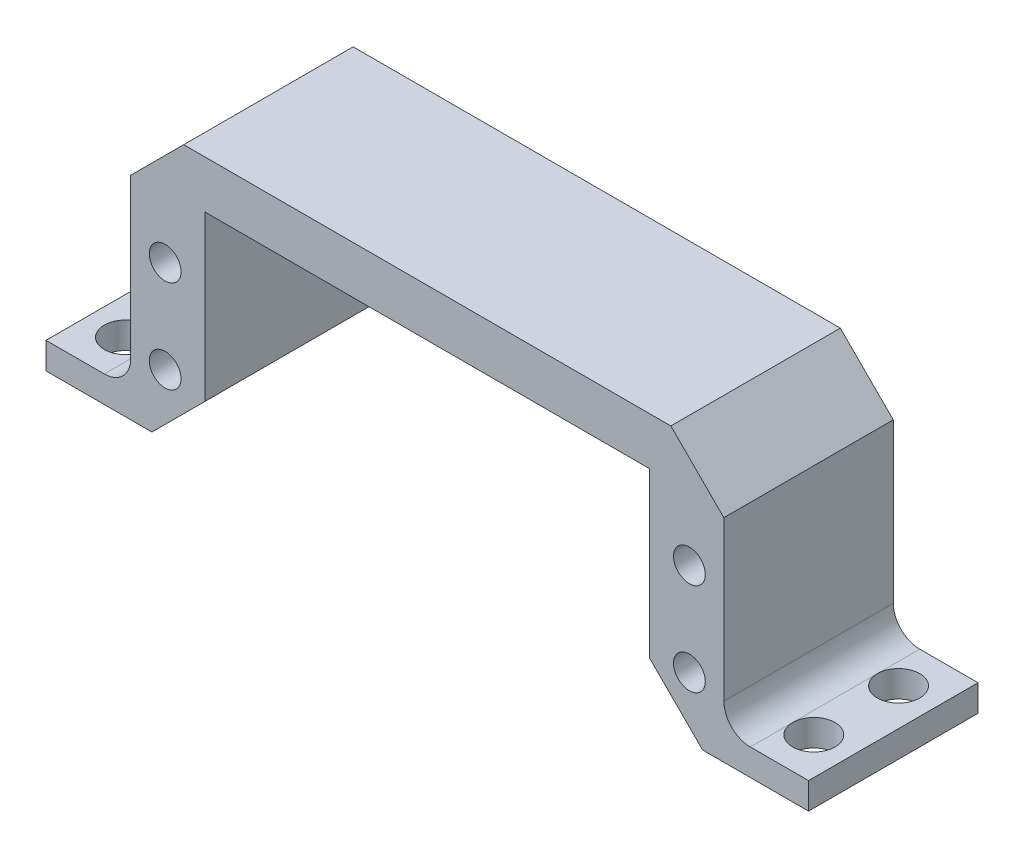
ISO-10303-21;
HEADER;
FILE_DESCRIPTION(('STEP AP214'),'2;1');
FILE_NAME('part.step','',(''),(''),'','','');
FILE_SCHEMA(('AUTOMOTIVE_DESIGN { 1 0 10303 214 1 1 1 1 }'));
ENDSEC;
DATA;
#1=APPLICATION_CONTEXT('core data for automotive mechanical design processes');
#2=APPLICATION_PROTOCOL_DEFINITION('international standard','automotive_design',2000,#1);
#3=PRODUCT_CONTEXT('',#1,'mechanical');
#4=PRODUCT('Part','Part','',(#3));
#5=PRODUCT_RELATED_PRODUCT_CATEGORY('part','',(#4));
#6=PRODUCT_DEFINITION_FORMATION('','',#4);
#7=PRODUCT_DEFINITION_CONTEXT('part definition',#1,'design');
#8=PRODUCT_DEFINITION('design','',#6,#7);
#9=PRODUCT_DEFINITION_SHAPE('','',#8);
#10=(LENGTH_UNIT() NAMED_UNIT(*) SI_UNIT(.MILLI.,.METRE.));
#11=(NAMED_UNIT(*) PLANE_ANGLE_UNIT() SI_UNIT($,.RADIAN.));
#12=(NAMED_UNIT(*) SI_UNIT($,.STERADIAN.) SOLID_ANGLE_UNIT());
#13=UNCERTAINTY_MEASURE_WITH_UNIT(LENGTH_MEASURE(1.E-05),#10,'distance_accuracy_value','');
#14=(GEOMETRIC_REPRESENTATION_CONTEXT(3) GLOBAL_UNCERTAINTY_ASSIGNED_CONTEXT((#13)) GLOBAL_UNIT_ASSIGNED_CONTEXT((#10,
#11,#12)) REPRESENTATION_CONTEXT('',''));
#15=CARTESIAN_POINT('',(0.,0.,0.));
#16=DIRECTION('',(0.,0.,1.));
#17=DIRECTION('',(1.,0.,0.));
#18=AXIS2_PLACEMENT_3D('',#15,#16,#17);
#19=CARTESIAN_POINT('',(-36.,0.,8.));
#20=DIRECTION('',(1.,0.,0.));
#21=DIRECTION('',(0.,0.,-1.));
#22=AXIS2_PLACEMENT_3D('',#19,#20,#21);
#23=PLANE('',#22);
#24=DIRECTION('',(0.,-1.,0.));
#25=VECTOR('',#24,1.);
#26=CARTESIAN_POINT('',(-36.,0.,-8.));
#27=LINE('',#26,#25);
#28=CARTESIAN_POINT('',(-36.,2.5,-8.));
#29=VERTEX_POINT('',#28);
#30=CARTESIAN_POINT('',(-36.,0.,-8.));
#31=VERTEX_POINT('',#30);
#32=EDGE_CURVE('E194',#29,#31,#27,.T.);
#33=ORIENTED_EDGE('',*,*,#32,.T.);
#34=DIRECTION('',(0.,0.,-1.));
#35=VECTOR('',#34,1.);
#36=CARTESIAN_POINT('',(-36.,0.,8.));
#37=LINE('',#36,#35);
#38=CARTESIAN_POINT('',(-36.,0.,8.));
#39=VERTEX_POINT('',#38);
#40=EDGE_CURVE('E174',#39,#31,#37,.T.);
#41=ORIENTED_EDGE('',*,*,#40,.F.);
#42=DIRECTION('',(0.,-1.,0.));
#43=VECTOR('',#42,1.);
#44=CARTESIAN_POINT('',(-36.,0.,8.));
#45=LINE('',#44,#43);
#46=CARTESIAN_POINT('',(-36.,2.5,8.));
#47=VERTEX_POINT('',#46);
#48=EDGE_CURVE('E181',#47,#39,#45,.T.);
#49=ORIENTED_EDGE('',*,*,#48,.F.);
#50=DIRECTION('',(0.,0.,-1.));
#51=VECTOR('',#50,1.);
#52=CARTESIAN_POINT('',(-36.,2.5,8.));
#53=LINE('',#52,#51);
#54=EDGE_CURVE('E283',#47,#29,#53,.T.);
#55=ORIENTED_EDGE('',*,*,#54,.T.);
#56=EDGE_LOOP('',(#33,#41,#49,#55));
#57=FACE_BOUND('',#56,.T.);
#58=ADVANCED_FACE('F35',(#57),#23,.F.);
#59=CARTESIAN_POINT('',(-36.,0.,8.));
#60=DIRECTION('',(0.,1.,0.));
#61=DIRECTION('',(-1.,0.,0.));
#62=AXIS2_PLACEMENT_3D('',#59,#60,#61);
#63=PLANE('',#62);
#64=CARTESIAN_POINT('',(-32.5,0.,-4.));
#65=DIRECTION('',(0.,1.,0.));
#66=DIRECTION('',(0.,0.,1.));
#67=AXIS2_PLACEMENT_3D('',#64,#65,#66);
#68=CIRCLE('',#67,2.);
#69=CARTESIAN_POINT('',(-32.5,0.,-1.99999999999999));
#70=VERTEX_POINT('',#69);
#71=EDGE_CURVE('E386',#70,#70,#68,.T.);
#72=ORIENTED_EDGE('',*,*,#71,.T.);
#73=EDGE_LOOP('',(#72));
#74=FACE_BOUND('',#73,.T.);
#75=CARTESIAN_POINT('',(-32.5,0.,4.));
#76=DIRECTION('',(0.,1.,0.));
#77=DIRECTION('',(0.,0.,1.));
#78=AXIS2_PLACEMENT_3D('',#75,#76,#77);
#79=CIRCLE('',#78,2.);
#80=CARTESIAN_POINT('',(-32.5,0.,6.00000000000001));
#81=VERTEX_POINT('',#80);
#82=EDGE_CURVE('E396',#81,#81,#79,.T.);
#83=ORIENTED_EDGE('',*,*,#82,.T.);
#84=EDGE_LOOP('',(#83));
#85=FACE_BOUND('',#84,.T.);
#86=DIRECTION('',(1.,0.,0.));
#87=VECTOR('',#86,1.);
#88=CARTESIAN_POINT('',(-36.,0.,-8.));
#89=LINE('',#88,#87);
#90=CARTESIAN_POINT('',(-26.,0.,-8.));
#91=VERTEX_POINT('',#90);
#92=EDGE_CURVE('E292',#31,#91,#89,.T.);
#93=ORIENTED_EDGE('',*,*,#92,.T.);
#94=DIRECTION('',(0.,0.,1.));
#95=VECTOR('',#94,1.);
#96=CARTESIAN_POINT('',(-26.,0.,8.));
#97=LINE('',#96,#95);
#98=CARTESIAN_POINT('',(-26.,0.,8.));
#99=VERTEX_POINT('',#98);
#100=EDGE_CURVE('E177',#91,#99,#97,.T.);
#101=ORIENTED_EDGE('',*,*,#100,.T.);
#102=DIRECTION('',(1.,0.,0.));
#103=VECTOR('',#102,1.);
#104=CARTESIAN_POINT('',(-36.,0.,8.));
#105=LINE('',#104,#103);
#106=EDGE_CURVE('E169',#39,#99,#105,.T.);
#107=ORIENTED_EDGE('',*,*,#106,.F.);
#108=ORIENTED_EDGE('',*,*,#40,.T.);
#109=EDGE_LOOP('',(#93,#101,#107,#108));
#110=FACE_BOUND('',#109,.T.);
#111=ADVANCED_FACE('F172',(#74,#85,#110),#63,.F.);
#112=CARTESIAN_POINT('',(-21.,0.,8.));
#113=DIRECTION('',(-1.,0.,0.));
#114=DIRECTION('',(0.,-1.,0.));
#115=AXIS2_PLACEMENT_3D('',#112,#113,#114);
#116=PLANE('',#115);
#117=DIRECTION('',(0.,1.,0.));
#118=VECTOR('',#117,1.);
#119=CARTESIAN_POINT('',(-21.,0.,8.));
#120=LINE('',#119,#118);
#121=CARTESIAN_POINT('',(-21.,4.99999999999999,8.));
#122=VERTEX_POINT('',#121);
#123=CARTESIAN_POINT('',(-21.,20.5,8.));
#124=VERTEX_POINT('',#123);
#125=EDGE_CURVE('E180',#122,#124,#120,.T.);
#126=ORIENTED_EDGE('',*,*,#125,.F.);
#127=DIRECTION('',(0.,0.,-1.));
#128=VECTOR('',#127,1.);
#129=CARTESIAN_POINT('',(-21.,4.99999999999999,8.));
#130=LINE('',#129,#128);
#131=CARTESIAN_POINT('',(-21.,4.99999999999999,-8.));
#132=VERTEX_POINT('',#131);
#133=EDGE_CURVE('E224',#122,#132,#130,.T.);
#134=ORIENTED_EDGE('',*,*,#133,.T.);
#135=DIRECTION('',(0.,1.,0.));
#136=VECTOR('',#135,1.);
#137=CARTESIAN_POINT('',(-21.,0.,-8.));
#138=LINE('',#137,#136);
#139=CARTESIAN_POINT('',(-21.,20.5,-8.));
#140=VERTEX_POINT('',#139);
#141=EDGE_CURVE('E295',#132,#140,#138,.T.);
#142=ORIENTED_EDGE('',*,*,#141,.T.);
#143=DIRECTION('',(0.,0.,-1.));
#144=VECTOR('',#143,1.);
#145=CARTESIAN_POINT('',(-21.,20.5,8.));
#146=LINE('',#145,#144);
#147=EDGE_CURVE('E196',#124,#140,#146,.T.);
#148=ORIENTED_EDGE('',*,*,#147,.F.);
#149=EDGE_LOOP('',(#126,#134,#142,#148));
#150=FACE_BOUND('',#149,.T.);
#151=ADVANCED_FACE('F428',(#150),#116,.F.);
#152=CARTESIAN_POINT('',(-21.,20.5,8.));
#153=DIRECTION('',(0.,1.,0.));
#154=DIRECTION('',(0.,0.,1.));
#155=AXIS2_PLACEMENT_3D('',#152,#153,#154);
#156=PLANE('',#155);
#157=DIRECTION('',(1.,0.,0.));
#158=VECTOR('',#157,1.);
#159=CARTESIAN_POINT('',(-21.,20.5,-8.));
#160=LINE('',#159,#158);
#161=CARTESIAN_POINT('',(21.,20.5,-8.));
#162=VERTEX_POINT('',#161);
#163=EDGE_CURVE('E297',#140,#162,#160,.T.);
#164=ORIENTED_EDGE('',*,*,#163,.T.);
#165=DIRECTION('',(0.,0.,-1.));
#166=VECTOR('',#165,1.);
#167=CARTESIAN_POINT('',(21.,20.5,8.));
#168=LINE('',#167,#166);
#169=CARTESIAN_POINT('',(21.,20.5,8.));
#170=VERTEX_POINT('',#169);
#171=EDGE_CURVE('E202',#170,#162,#168,.T.);
#172=ORIENTED_EDGE('',*,*,#171,.F.);
#173=DIRECTION('',(1.,0.,0.));
#174=VECTOR('',#173,1.);
#175=CARTESIAN_POINT('',(-21.,20.5,8.));
#176=LINE('',#175,#174);
#177=EDGE_CURVE('E345',#124,#170,#176,.T.);
#178=ORIENTED_EDGE('',*,*,#177,.F.);
#179=ORIENTED_EDGE('',*,*,#147,.T.);
#180=EDGE_LOOP('',(#164,#172,#178,#179));
#181=FACE_BOUND('',#180,.T.);
#182=ADVANCED_FACE('F426',(#181),#156,.F.);
#183=CARTESIAN_POINT('',(21.,20.5,8.));
#184=DIRECTION('',(1.,0.,0.));
#185=DIRECTION('',(0.,0.,-1.));
#186=AXIS2_PLACEMENT_3D('',#183,#184,#185);
#187=PLANE('',#186);
#188=DIRECTION('',(0.,-1.,0.));
#189=VECTOR('',#188,1.);
#190=CARTESIAN_POINT('',(21.,20.5,-8.));
#191=LINE('',#190,#189);
#192=CARTESIAN_POINT('',(21.,5.00000000000002,-8.));
#193=VERTEX_POINT('',#192);
#194=EDGE_CURVE('E299',#162,#193,#191,.T.);
#195=ORIENTED_EDGE('',*,*,#194,.T.);
#196=DIRECTION('',(0.,0.,1.));
#197=VECTOR('',#196,1.);
#198=CARTESIAN_POINT('',(21.,5.00000000000002,8.));
#199=LINE('',#198,#197);
#200=CARTESIAN_POINT('',(21.,5.00000000000002,8.));
#201=VERTEX_POINT('',#200);
#202=EDGE_CURVE('E214',#193,#201,#199,.T.);
#203=ORIENTED_EDGE('',*,*,#202,.T.);
#204=DIRECTION('',(0.,-1.,0.));
#205=VECTOR('',#204,1.);
#206=CARTESIAN_POINT('',(21.,20.5,8.));
#207=LINE('',#206,#205);
#208=EDGE_CURVE('E325',#170,#201,#207,.T.);
#209=ORIENTED_EDGE('',*,*,#208,.F.);
#210=ORIENTED_EDGE('',*,*,#171,.T.);
#211=EDGE_LOOP('',(#195,#203,#209,#210));
#212=FACE_BOUND('',#211,.T.);
#213=ADVANCED_FACE('F323',(#212),#187,.F.);
#214=CARTESIAN_POINT('',(21.,0.,8.));
#215=DIRECTION('',(0.,1.,0.));
#216=DIRECTION('',(0.,0.,1.));
#217=AXIS2_PLACEMENT_3D('',#214,#215,#216);
#218=PLANE('',#217);
#219=CARTESIAN_POINT('',(32.5,0.,4.));
#220=DIRECTION('',(0.,1.,0.));
#221=DIRECTION('',(0.,0.,1.));
#222=AXIS2_PLACEMENT_3D('',#219,#220,#221);
#223=CIRCLE('',#222,2.00000000000001);
#224=CARTESIAN_POINT('',(32.5,0.,6.00000000000001));
#225=VERTEX_POINT('',#224);
#226=EDGE_CURVE('E385',#225,#225,#223,.T.);
#227=ORIENTED_EDGE('',*,*,#226,.T.);
#228=EDGE_LOOP('',(#227));
#229=FACE_BOUND('',#228,.T.);
#230=CARTESIAN_POINT('',(32.5,0.,-4.));
#231=DIRECTION('',(0.,1.,0.));
#232=DIRECTION('',(0.,0.,1.));
#233=AXIS2_PLACEMENT_3D('',#230,#231,#232);
#234=CIRCLE('',#233,2.00000000000001);
#235=CARTESIAN_POINT('',(32.5,0.,-1.99999999999999));
#236=VERTEX_POINT('',#235);
#237=EDGE_CURVE('E397',#236,#236,#234,.T.);
#238=ORIENTED_EDGE('',*,*,#237,.T.);
#239=EDGE_LOOP('',(#238));
#240=FACE_BOUND('',#239,.T.);
#241=DIRECTION('',(1.,0.,0.));
#242=VECTOR('',#241,1.);
#243=CARTESIAN_POINT('',(21.,0.,8.));
#244=LINE('',#243,#242);
#245=CARTESIAN_POINT('',(26.,0.,8.));
#246=VERTEX_POINT('',#245);
#247=CARTESIAN_POINT('',(36.,0.,8.));
#248=VERTEX_POINT('',#247);
#249=EDGE_CURVE('E339',#246,#248,#244,.T.);
#250=ORIENTED_EDGE('',*,*,#249,.F.);
#251=DIRECTION('',(0.,0.,-1.));
#252=VECTOR('',#251,1.);
#253=CARTESIAN_POINT('',(26.,0.,8.));
#254=LINE('',#253,#252);
#255=CARTESIAN_POINT('',(26.,0.,-8.));
#256=VERTEX_POINT('',#255);
#257=EDGE_CURVE('E195',#246,#256,#254,.T.);
#258=ORIENTED_EDGE('',*,*,#257,.T.);
#259=DIRECTION('',(1.,0.,0.));
#260=VECTOR('',#259,1.);
#261=CARTESIAN_POINT('',(21.,0.,-8.));
#262=LINE('',#261,#260);
#263=CARTESIAN_POINT('',(36.,0.,-8.));
#264=VERTEX_POINT('',#263);
#265=EDGE_CURVE('E302',#256,#264,#262,.T.);
#266=ORIENTED_EDGE('',*,*,#265,.T.);
#267=DIRECTION('',(0.,0.,-1.));
#268=VECTOR('',#267,1.);
#269=CARTESIAN_POINT('',(36.,0.,8.));
#270=LINE('',#269,#268);
#271=EDGE_CURVE('E316',#248,#264,#270,.T.);
#272=ORIENTED_EDGE('',*,*,#271,.F.);
#273=EDGE_LOOP('',(#250,#258,#266,#272));
#274=FACE_BOUND('',#273,.T.);
#275=ADVANCED_FACE('F337',(#229,#240,#274),#218,.F.);
#276=CARTESIAN_POINT('',(36.,0.,8.));
#277=DIRECTION('',(-1.,0.,0.));
#278=DIRECTION('',(0.,0.,1.));
#279=AXIS2_PLACEMENT_3D('',#276,#277,#278);
#280=PLANE('',#279);
#281=DIRECTION('',(0.,1.,0.));
#282=VECTOR('',#281,1.);
#283=CARTESIAN_POINT('',(36.,0.,-8.));
#284=LINE('',#283,#282);
#285=CARTESIAN_POINT('',(36.,2.5,-8.));
#286=VERTEX_POINT('',#285);
#287=EDGE_CURVE('E304',#264,#286,#284,.T.);
#288=ORIENTED_EDGE('',*,*,#287,.T.);
#289=DIRECTION('',(0.,0.,-1.));
#290=VECTOR('',#289,1.);
#291=CARTESIAN_POINT('',(36.,2.5,8.));
#292=LINE('',#291,#290);
#293=CARTESIAN_POINT('',(36.,2.5,8.));
#294=VERTEX_POINT('',#293);
#295=EDGE_CURVE('E285',#294,#286,#292,.T.);
#296=ORIENTED_EDGE('',*,*,#295,.F.);
#297=DIRECTION('',(0.,1.,0.));
#298=VECTOR('',#297,1.);
#299=CARTESIAN_POINT('',(36.,0.,8.));
#300=LINE('',#299,#298);
#301=EDGE_CURVE('E341',#248,#294,#300,.T.);
#302=ORIENTED_EDGE('',*,*,#301,.F.);
#303=ORIENTED_EDGE('',*,*,#271,.T.);
#304=EDGE_LOOP('',(#288,#296,#302,#303));
#305=FACE_BOUND('',#304,.T.);
#306=ADVANCED_FACE('F384',(#305),#280,.F.);
#307=CARTESIAN_POINT('',(36.,2.5,8.));
#308=DIRECTION('',(0.,-1.,0.));
#309=DIRECTION('',(1.,0.,0.));
#310=AXIS2_PLACEMENT_3D('',#307,#308,#309);
#311=PLANE('',#310);
#312=DIRECTION('',(0.,0.,-1.));
#313=VECTOR('',#312,1.);
#314=CARTESIAN_POINT('',(30.5,2.5,8.));
#315=LINE('',#314,#313);
#316=CARTESIAN_POINT('',(30.5,2.5,-4.));
#317=VERTEX_POINT('',#316);
#318=CARTESIAN_POINT('',(30.5,2.5,4.));
#319=VERTEX_POINT('',#318);
#320=EDGE_CURVE('E247',#317,#319,#315,.F.);
#321=ORIENTED_EDGE('',*,*,#320,.T.);
#322=CARTESIAN_POINT('',(32.5,2.5,4.));
#323=DIRECTION('',(0.,1.,0.));
#324=DIRECTION('',(0.,0.,1.));
#325=AXIS2_PLACEMENT_3D('',#322,#323,#324);
#326=CIRCLE('',#325,2.00000000000001);
#327=EDGE_CURVE('E48',#319,#319,#326,.T.);
#328=ORIENTED_EDGE('',*,*,#327,.F.);
#329=CARTESIAN_POINT('',(30.5,2.5,8.));
#330=VERTEX_POINT('',#329);
#331=EDGE_CURVE('E242',#319,#330,#315,.F.);
#332=ORIENTED_EDGE('',*,*,#331,.T.);
#333=DIRECTION('',(-1.,0.,0.));
#334=VECTOR('',#333,1.);
#335=CARTESIAN_POINT('',(36.,2.5,8.));
#336=LINE('',#335,#334);
#337=EDGE_CURVE('E343',#294,#330,#336,.T.);
#338=ORIENTED_EDGE('',*,*,#337,.F.);
#339=ORIENTED_EDGE('',*,*,#295,.T.);
#340=DIRECTION('',(-1.,0.,0.));
#341=VECTOR('',#340,1.);
#342=CARTESIAN_POINT('',(36.,2.5,-8.));
#343=LINE('',#342,#341);
#344=CARTESIAN_POINT('',(30.5,2.5,-8.));
#345=VERTEX_POINT('',#344);
#346=EDGE_CURVE('E306',#286,#345,#343,.T.);
#347=ORIENTED_EDGE('',*,*,#346,.T.);
#348=EDGE_CURVE('E243',#345,#317,#315,.F.);
#349=ORIENTED_EDGE('',*,*,#348,.T.);
#350=CARTESIAN_POINT('',(32.5,2.5,-4.));
#351=DIRECTION('',(0.,1.,0.));
#352=DIRECTION('',(0.,0.,1.));
#353=AXIS2_PLACEMENT_3D('',#350,#351,#352);
#354=CIRCLE('',#353,2.00000000000001);
#355=EDGE_CURVE('E53',#317,#317,#354,.T.);
#356=ORIENTED_EDGE('',*,*,#355,.F.);
#357=EDGE_LOOP('',(#321,#328,#332,#338,#339,#347,#349,#356));
#358=FACE_BOUND('',#357,.T.);
#359=ADVANCED_FACE('F380',(#358),#311,.F.);
#360=CARTESIAN_POINT('',(28.,25.,8.));
#361=DIRECTION('',(-1.,0.,0.));
#362=DIRECTION('',(0.,-1.,0.));
#363=AXIS2_PLACEMENT_3D('',#360,#361,#362);
#364=PLANE('',#363);
#365=DIRECTION('',(0.,1.,0.));
#366=VECTOR('',#365,1.);
#367=CARTESIAN_POINT('',(28.,25.,8.));
#368=LINE('',#367,#366);
#369=CARTESIAN_POINT('',(28.,5.00000000000001,8.));
#370=VERTEX_POINT('',#369);
#371=CARTESIAN_POINT('',(28.,20.,8.));
#372=VERTEX_POINT('',#371);
#373=EDGE_CURVE('E351',#370,#372,#368,.T.);
#374=ORIENTED_EDGE('',*,*,#373,.F.);
#375=DIRECTION('',(0.,0.,-1.));
#376=VECTOR('',#375,1.);
#377=CARTESIAN_POINT('',(28.,5.,-8.));
#378=LINE('',#377,#376);
#379=CARTESIAN_POINT('',(28.,5.00000000000001,-8.));
#380=VERTEX_POINT('',#379);
#381=EDGE_CURVE('E239',#370,#380,#378,.T.);
#382=ORIENTED_EDGE('',*,*,#381,.T.);
#383=DIRECTION('',(0.,1.,0.));
#384=VECTOR('',#383,1.);
#385=CARTESIAN_POINT('',(28.,25.,-8.));
#386=LINE('',#385,#384);
#387=CARTESIAN_POINT('',(28.,20.,-8.));
#388=VERTEX_POINT('',#387);
#389=EDGE_CURVE('E309',#380,#388,#386,.T.);
#390=ORIENTED_EDGE('',*,*,#389,.T.);
#391=DIRECTION('',(0.,0.,1.));
#392=VECTOR('',#391,1.);
#393=CARTESIAN_POINT('',(28.,20.,8.));
#394=LINE('',#393,#392);
#395=EDGE_CURVE('E236',#388,#372,#394,.T.);
#396=ORIENTED_EDGE('',*,*,#395,.T.);
#397=EDGE_LOOP('',(#374,#382,#390,#396));
#398=FACE_BOUND('',#397,.T.);
#399=ADVANCED_FACE('F370',(#398),#364,.F.);
#400=CARTESIAN_POINT('',(-28.,25.,8.));
#401=DIRECTION('',(0.,-1.,0.));
#402=DIRECTION('',(0.,0.,-1.));
#403=AXIS2_PLACEMENT_3D('',#400,#401,#402);
#404=PLANE('',#403);
#405=DIRECTION('',(-1.,0.,0.));
#406=VECTOR('',#405,1.);
#407=CARTESIAN_POINT('',(-28.,25.,-8.));
#408=LINE('',#407,#406);
#409=CARTESIAN_POINT('',(23.,25.,-8.));
#410=VERTEX_POINT('',#409);
#411=CARTESIAN_POINT('',(-23.,25.,-8.));
#412=VERTEX_POINT('',#411);
#413=EDGE_CURVE('E273',#410,#412,#408,.T.);
#414=ORIENTED_EDGE('',*,*,#413,.T.);
#415=DIRECTION('',(0.,0.,1.));
#416=VECTOR('',#415,1.);
#417=CARTESIAN_POINT('',(-23.,25.,8.));
#418=LINE('',#417,#416);
#419=CARTESIAN_POINT('',(-23.,25.,8.));
#420=VERTEX_POINT('',#419);
#421=EDGE_CURVE('E234',#412,#420,#418,.T.);
#422=ORIENTED_EDGE('',*,*,#421,.T.);
#423=DIRECTION('',(-1.,0.,0.));
#424=VECTOR('',#423,1.);
#425=CARTESIAN_POINT('',(-28.,25.,8.));
#426=LINE('',#425,#424);
#427=CARTESIAN_POINT('',(23.,25.,8.));
#428=VERTEX_POINT('',#427);
#429=EDGE_CURVE('E287',#428,#420,#426,.T.);
#430=ORIENTED_EDGE('',*,*,#429,.F.);
#431=DIRECTION('',(0.,0.,-1.));
#432=VECTOR('',#431,1.);
#433=CARTESIAN_POINT('',(23.,25.,8.));
#434=LINE('',#433,#432);
#435=EDGE_CURVE('E231',#428,#410,#434,.T.);
#436=ORIENTED_EDGE('',*,*,#435,.T.);
#437=EDGE_LOOP('',(#414,#422,#430,#436));
#438=FACE_BOUND('',#437,.T.);
#439=ADVANCED_FACE('F362',(#438),#404,.F.);
#440=CARTESIAN_POINT('',(-28.,2.5,8.));
#441=DIRECTION('',(1.,0.,0.));
#442=DIRECTION('',(0.,0.,-1.));
#443=AXIS2_PLACEMENT_3D('',#440,#441,#442);
#444=PLANE('',#443);
#445=DIRECTION('',(0.,-1.,0.));
#446=VECTOR('',#445,1.);
#447=CARTESIAN_POINT('',(-28.,2.5,-8.));
#448=LINE('',#447,#446);
#449=CARTESIAN_POINT('',(-28.,20.,-8.));
#450=VERTEX_POINT('',#449);
#451=CARTESIAN_POINT('',(-28.,5.,-8.));
#452=VERTEX_POINT('',#451);
#453=EDGE_CURVE('E264',#450,#452,#448,.T.);
#454=ORIENTED_EDGE('',*,*,#453,.T.);
#455=DIRECTION('',(0.,0.,-1.));
#456=VECTOR('',#455,1.);
#457=CARTESIAN_POINT('',(-28.,5.,8.));
#458=LINE('',#457,#456);
#459=CARTESIAN_POINT('',(-28.,5.,8.));
#460=VERTEX_POINT('',#459);
#461=EDGE_CURVE('E251',#452,#460,#458,.F.);
#462=ORIENTED_EDGE('',*,*,#461,.T.);
#463=DIRECTION('',(0.,-1.,0.));
#464=VECTOR('',#463,1.);
#465=CARTESIAN_POINT('',(-28.,2.5,8.));
#466=LINE('',#465,#464);
#467=CARTESIAN_POINT('',(-28.,20.,8.));
#468=VERTEX_POINT('',#467);
#469=EDGE_CURVE('E278',#468,#460,#466,.T.);
#470=ORIENTED_EDGE('',*,*,#469,.F.);
#471=DIRECTION('',(0.,0.,-1.));
#472=VECTOR('',#471,1.);
#473=CARTESIAN_POINT('',(-28.,20.,8.));
#474=LINE('',#473,#472);
#475=EDGE_CURVE('E228',#468,#450,#474,.T.);
#476=ORIENTED_EDGE('',*,*,#475,.T.);
#477=EDGE_LOOP('',(#454,#462,#470,#476));
#478=FACE_BOUND('',#477,.T.);
#479=ADVANCED_FACE('F269',(#478),#444,.F.);
#480=CARTESIAN_POINT('',(-36.,2.5,8.));
#481=DIRECTION('',(0.,-1.,0.));
#482=DIRECTION('',(0.,0.,-1.));
#483=AXIS2_PLACEMENT_3D('',#480,#481,#482);
#484=PLANE('',#483);
#485=DIRECTION('',(0.,0.,-1.));
#486=VECTOR('',#485,1.);
#487=CARTESIAN_POINT('',(-30.5,2.5,-8.));
#488=LINE('',#487,#486);
#489=CARTESIAN_POINT('',(-30.5,2.5,4.));
#490=VERTEX_POINT('',#489);
#491=CARTESIAN_POINT('',(-30.5,2.5,-4.));
#492=VERTEX_POINT('',#491);
#493=EDGE_CURVE('E252',#490,#492,#488,.T.);
#494=ORIENTED_EDGE('',*,*,#493,.T.);
#495=CARTESIAN_POINT('',(-32.5,2.5,-4.));
#496=DIRECTION('',(0.,1.,0.));
#497=DIRECTION('',(0.,0.,1.));
#498=AXIS2_PLACEMENT_3D('',#495,#496,#497);
#499=CIRCLE('',#498,2.);
#500=EDGE_CURVE('E391',#492,#492,#499,.T.);
#501=ORIENTED_EDGE('',*,*,#500,.F.);
#502=CARTESIAN_POINT('',(-30.5,2.5,-8.));
#503=VERTEX_POINT('',#502);
#504=EDGE_CURVE('E246',#492,#503,#488,.T.);
#505=ORIENTED_EDGE('',*,*,#504,.T.);
#506=DIRECTION('',(-1.,0.,0.));
#507=VECTOR('',#506,1.);
#508=CARTESIAN_POINT('',(-36.,2.5,-8.));
#509=LINE('',#508,#507);
#510=EDGE_CURVE('E191',#503,#29,#509,.T.);
#511=ORIENTED_EDGE('',*,*,#510,.T.);
#512=ORIENTED_EDGE('',*,*,#54,.F.);
#513=DIRECTION('',(-1.,0.,0.));
#514=VECTOR('',#513,1.);
#515=CARTESIAN_POINT('',(-36.,2.5,8.));
#516=LINE('',#515,#514);
#517=CARTESIAN_POINT('',(-30.5,2.5,8.));
#518=VERTEX_POINT('',#517);
#519=EDGE_CURVE('E187',#518,#47,#516,.T.);
#520=ORIENTED_EDGE('',*,*,#519,.F.);
#521=EDGE_CURVE('E248',#518,#490,#488,.T.);
#522=ORIENTED_EDGE('',*,*,#521,.T.);
#523=CARTESIAN_POINT('',(-32.5,2.5,4.));
#524=DIRECTION('',(0.,1.,0.));
#525=DIRECTION('',(0.,0.,1.));
#526=AXIS2_PLACEMENT_3D('',#523,#524,#525);
#527=CIRCLE('',#526,2.);
#528=EDGE_CURVE('E662',#490,#490,#527,.T.);
#529=ORIENTED_EDGE('',*,*,#528,.F.);
#530=EDGE_LOOP('',(#494,#501,#505,#511,#512,#520,#522,#529));
#531=FACE_BOUND('',#530,.T.);
#532=ADVANCED_FACE('F281',(#531),#484,.F.);
#533=CARTESIAN_POINT('',(0.,0.,8.));
#534=DIRECTION('',(0.,0.,-1.));
#535=DIRECTION('',(-1.,0.,0.));
#536=AXIS2_PLACEMENT_3D('',#533,#534,#535);
#537=PLANE('',#536);
#538=CARTESIAN_POINT('',(-24.75,5.725,8.));
#539=DIRECTION('',(0.,0.,1.));
#540=DIRECTION('',(1.,0.,0.));
#541=AXIS2_PLACEMENT_3D('',#538,#539,#540);
#542=CIRCLE('',#541,1.5);
#543=CARTESIAN_POINT('',(-23.25,5.725,8.));
#544=VERTEX_POINT('',#543);
#545=EDGE_CURVE('E412',#544,#544,#542,.T.);
#546=ORIENTED_EDGE('',*,*,#545,.F.);
#547=EDGE_LOOP('',(#546));
#548=FACE_BOUND('',#547,.T.);
#549=CARTESIAN_POINT('',(24.75,14.475,8.));
#550=DIRECTION('',(0.,0.,1.));
#551=DIRECTION('',(1.,0.,0.));
#552=AXIS2_PLACEMENT_3D('',#549,#550,#551);
#553=CIRCLE('',#552,1.5);
#554=CARTESIAN_POINT('',(26.25,14.475,8.));
#555=VERTEX_POINT('',#554);
#556=EDGE_CURVE('E405',#555,#555,#553,.T.);
#557=ORIENTED_EDGE('',*,*,#556,.F.);
#558=EDGE_LOOP('',(#557));
#559=FACE_BOUND('',#558,.T.);
#560=CARTESIAN_POINT('',(24.75,5.725,8.));
#561=DIRECTION('',(0.,0.,1.));
#562=DIRECTION('',(1.,0.,0.));
#563=AXIS2_PLACEMENT_3D('',#560,#561,#562);
#564=CIRCLE('',#563,1.5);
#565=CARTESIAN_POINT('',(26.25,5.725,8.));
#566=VERTEX_POINT('',#565);
#567=EDGE_CURVE('E400',#566,#566,#564,.T.);
#568=ORIENTED_EDGE('',*,*,#567,.F.);
#569=EDGE_LOOP('',(#568));
#570=FACE_BOUND('',#569,.T.);
#571=CARTESIAN_POINT('',(-24.75,14.475,8.));
#572=DIRECTION('',(0.,0.,1.));
#573=DIRECTION('',(1.,0.,0.));
#574=AXIS2_PLACEMENT_3D('',#571,#572,#573);
#575=CIRCLE('',#574,1.5);
#576=CARTESIAN_POINT('',(-23.25,14.475,8.));
#577=VERTEX_POINT('',#576);
#578=EDGE_CURVE('E411',#577,#577,#575,.T.);
#579=ORIENTED_EDGE('',*,*,#578,.F.);
#580=EDGE_LOOP('',(#579));
#581=FACE_BOUND('',#580,.T.);
#582=ORIENTED_EDGE('',*,*,#208,.T.);
#583=DIRECTION('',(-0.707106781186546,0.707106781186549,0.));
#584=VECTOR('',#583,1.);
#585=CARTESIAN_POINT('',(26.,0.,8.));
#586=LINE('',#585,#584);
#587=EDGE_CURVE('E222',#201,#246,#586,.F.);
#588=ORIENTED_EDGE('',*,*,#587,.T.);
#589=ORIENTED_EDGE('',*,*,#249,.T.);
#590=ORIENTED_EDGE('',*,*,#301,.T.);
#591=ORIENTED_EDGE('',*,*,#337,.T.);
#592=CARTESIAN_POINT('',(30.5,5.,8.));
#593=DIRECTION('',(0.,0.,-1.));
#594=DIRECTION('',(-1.,0.,0.));
#595=AXIS2_PLACEMENT_3D('',#592,#593,#594);
#596=CIRCLE('',#595,2.5);
#597=EDGE_CURVE('E256',#330,#370,#596,.T.);
#598=ORIENTED_EDGE('',*,*,#597,.T.);
#599=ORIENTED_EDGE('',*,*,#373,.T.);
#600=DIRECTION('',(0.707106781186546,-0.707106781186549,0.));
#601=VECTOR('',#600,1.);
#602=CARTESIAN_POINT('',(23.,25.,8.));
#603=LINE('',#602,#601);
#604=EDGE_CURVE('E216',#372,#428,#603,.F.);
#605=ORIENTED_EDGE('',*,*,#604,.T.);
#606=ORIENTED_EDGE('',*,*,#429,.T.);
#607=DIRECTION('',(0.707106781186549,0.707106781186546,0.));
#608=VECTOR('',#607,1.);
#609=CARTESIAN_POINT('',(-28.,20.,8.));
#610=LINE('',#609,#608);
#611=EDGE_CURVE('E218',#420,#468,#610,.F.);
#612=ORIENTED_EDGE('',*,*,#611,.T.);
#613=ORIENTED_EDGE('',*,*,#469,.T.);
#614=CARTESIAN_POINT('',(-30.5,5.,8.));
#615=DIRECTION('',(0.,0.,-1.));
#616=DIRECTION('',(-1.,0.,0.));
#617=AXIS2_PLACEMENT_3D('',#614,#615,#616);
#618=CIRCLE('',#617,2.5);
#619=EDGE_CURVE('E11',#460,#518,#618,.T.);
#620=ORIENTED_EDGE('',*,*,#619,.T.);
#621=ORIENTED_EDGE('',*,*,#519,.T.);
#622=ORIENTED_EDGE('',*,*,#48,.T.);
#623=ORIENTED_EDGE('',*,*,#106,.T.);
#624=DIRECTION('',(-0.707106781186549,-0.707106781186546,0.));
#625=VECTOR('',#624,1.);
#626=CARTESIAN_POINT('',(-21.,4.99999999999999,8.));
#627=LINE('',#626,#625);
#628=EDGE_CURVE('E220',#99,#122,#627,.F.);
#629=ORIENTED_EDGE('',*,*,#628,.T.);
#630=ORIENTED_EDGE('',*,*,#125,.T.);
#631=ORIENTED_EDGE('',*,*,#177,.T.);
#632=EDGE_LOOP('',(#582,#588,#589,#590,#591,#598,#599,#605,#606,#612,#613,#620,#621,#622,#623,
#629,#630,#631));
#633=FACE_BOUND('',#632,.T.);
#634=ADVANCED_FACE('F185',(#548,#559,#570,#581,#633),#537,.F.);
#635=CARTESIAN_POINT('',(0.,0.,-8.));
#636=DIRECTION('',(0.,0.,-1.));
#637=DIRECTION('',(-1.,0.,0.));
#638=AXIS2_PLACEMENT_3D('',#635,#636,#637);
#639=PLANE('',#638);
#640=CARTESIAN_POINT('',(-24.75,5.725,-8.));
#641=DIRECTION('',(0.,0.,1.));
#642=DIRECTION('',(1.,0.,0.));
#643=AXIS2_PLACEMENT_3D('',#640,#641,#642);
#644=CIRCLE('',#643,1.5);
#645=CARTESIAN_POINT('',(-23.25,5.725,-8.));
#646=VERTEX_POINT('',#645);
#647=EDGE_CURVE('E408',#646,#646,#644,.T.);
#648=ORIENTED_EDGE('',*,*,#647,.T.);
#649=EDGE_LOOP('',(#648));
#650=FACE_BOUND('',#649,.T.);
#651=CARTESIAN_POINT('',(24.75,14.475,-8.));
#652=DIRECTION('',(0.,0.,1.));
#653=DIRECTION('',(1.,0.,0.));
#654=AXIS2_PLACEMENT_3D('',#651,#652,#653);
#655=CIRCLE('',#654,1.5);
#656=CARTESIAN_POINT('',(26.25,14.475,-8.));
#657=VERTEX_POINT('',#656);
#658=EDGE_CURVE('E415',#657,#657,#655,.T.);
#659=ORIENTED_EDGE('',*,*,#658,.T.);
#660=EDGE_LOOP('',(#659));
#661=FACE_BOUND('',#660,.T.);
#662=CARTESIAN_POINT('',(24.75,5.725,-8.));
#663=DIRECTION('',(0.,0.,1.));
#664=DIRECTION('',(1.,0.,0.));
#665=AXIS2_PLACEMENT_3D('',#662,#663,#664);
#666=CIRCLE('',#665,1.5);
#667=CARTESIAN_POINT('',(26.25,5.725,-8.));
#668=VERTEX_POINT('',#667);
#669=EDGE_CURVE('E402',#668,#668,#666,.T.);
#670=ORIENTED_EDGE('',*,*,#669,.T.);
#671=EDGE_LOOP('',(#670));
#672=FACE_BOUND('',#671,.T.);
#673=CARTESIAN_POINT('',(-24.75,14.475,-8.));
#674=DIRECTION('',(0.,0.,1.));
#675=DIRECTION('',(1.,0.,0.));
#676=AXIS2_PLACEMENT_3D('',#673,#674,#675);
#677=CIRCLE('',#676,1.5);
#678=CARTESIAN_POINT('',(-23.25,14.475,-8.));
#679=VERTEX_POINT('',#678);
#680=EDGE_CURVE('E293',#679,#679,#677,.T.);
#681=ORIENTED_EDGE('',*,*,#680,.T.);
#682=EDGE_LOOP('',(#681));
#683=FACE_BOUND('',#682,.T.);
#684=ORIENTED_EDGE('',*,*,#265,.F.);
#685=DIRECTION('',(0.707106781186546,-0.707106781186549,0.));
#686=VECTOR('',#685,1.);
#687=CARTESIAN_POINT('',(13.0000000000001,13.,-8.));
#688=LINE('',#687,#686);
#689=EDGE_CURVE('E212',#256,#193,#688,.F.);
#690=ORIENTED_EDGE('',*,*,#689,.T.);
#691=ORIENTED_EDGE('',*,*,#194,.F.);
#692=ORIENTED_EDGE('',*,*,#163,.F.);
#693=ORIENTED_EDGE('',*,*,#141,.F.);
#694=DIRECTION('',(0.707106781186549,0.707106781186546,0.));
#695=VECTOR('',#694,1.);
#696=CARTESIAN_POINT('',(-13.,13.,-8.));
#697=LINE('',#696,#695);
#698=EDGE_CURVE('E210',#132,#91,#697,.F.);
#699=ORIENTED_EDGE('',*,*,#698,.T.);
#700=ORIENTED_EDGE('',*,*,#92,.F.);
#701=ORIENTED_EDGE('',*,*,#32,.F.);
#702=ORIENTED_EDGE('',*,*,#510,.F.);
#703=CARTESIAN_POINT('',(-30.5,5.,-8.));
#704=DIRECTION('',(0.,0.,-1.));
#705=DIRECTION('',(-1.,0.,0.));
#706=AXIS2_PLACEMENT_3D('',#703,#704,#705);
#707=CIRCLE('',#706,2.5);
#708=EDGE_CURVE('E43',#503,#452,#707,.F.);
#709=ORIENTED_EDGE('',*,*,#708,.T.);
#710=ORIENTED_EDGE('',*,*,#453,.F.);
#711=DIRECTION('',(-0.707106781186549,-0.707106781186546,0.));
#712=VECTOR('',#711,1.);
#713=CARTESIAN_POINT('',(-23.9999999999999,24.,-8.));
#714=LINE('',#713,#712);
#715=EDGE_CURVE('E208',#450,#412,#714,.F.);
#716=ORIENTED_EDGE('',*,*,#715,.T.);
#717=ORIENTED_EDGE('',*,*,#413,.F.);
#718=DIRECTION('',(-0.707106781186546,0.707106781186549,0.));
#719=VECTOR('',#718,1.);
#720=CARTESIAN_POINT('',(24.0000000000001,24.,-8.));
#721=LINE('',#720,#719);
#722=EDGE_CURVE('E199',#410,#388,#721,.F.);
#723=ORIENTED_EDGE('',*,*,#722,.T.);
#724=ORIENTED_EDGE('',*,*,#389,.F.);
#725=CARTESIAN_POINT('',(30.5,5.,-8.));
#726=DIRECTION('',(0.,0.,-1.));
#727=DIRECTION('',(-1.,0.,0.));
#728=AXIS2_PLACEMENT_3D('',#725,#726,#727);
#729=CIRCLE('',#728,2.5);
#730=EDGE_CURVE('E254',#380,#345,#729,.F.);
#731=ORIENTED_EDGE('',*,*,#730,.T.);
#732=ORIENTED_EDGE('',*,*,#346,.F.);
#733=ORIENTED_EDGE('',*,*,#287,.F.);
#734=EDGE_LOOP('',(#684,#690,#691,#692,#693,#699,#700,#701,#702,#709,#710,#716,#717,#723,#724,
#731,#732,#733));
#735=FACE_BOUND('',#734,.T.);
#736=ADVANCED_FACE('F263',(#650,#661,#672,#683,#735),#639,.T.);
#737=CARTESIAN_POINT('',(26.,0.,8.));
#738=DIRECTION('',(0.707106781186549,0.707106781186546,0.));
#739=DIRECTION('',(0.,0.,-1.));
#740=AXIS2_PLACEMENT_3D('',#737,#738,#739);
#741=PLANE('',#740);
#742=ORIENTED_EDGE('',*,*,#587,.F.);
#743=ORIENTED_EDGE('',*,*,#202,.F.);
#744=ORIENTED_EDGE('',*,*,#689,.F.);
#745=ORIENTED_EDGE('',*,*,#257,.F.);
#746=EDGE_LOOP('',(#742,#743,#744,#745));
#747=FACE_BOUND('',#746,.T.);
#748=ADVANCED_FACE('F334',(#747),#741,.F.);
#749=CARTESIAN_POINT('',(-21.,4.99999999999999,8.));
#750=DIRECTION('',(-0.707106781186546,0.707106781186549,0.));
#751=DIRECTION('',(0.,0.,-1.));
#752=AXIS2_PLACEMENT_3D('',#749,#750,#751);
#753=PLANE('',#752);
#754=ORIENTED_EDGE('',*,*,#628,.F.);
#755=ORIENTED_EDGE('',*,*,#100,.F.);
#756=ORIENTED_EDGE('',*,*,#698,.F.);
#757=ORIENTED_EDGE('',*,*,#133,.F.);
#758=EDGE_LOOP('',(#754,#755,#756,#757));
#759=FACE_BOUND('',#758,.T.);
#760=ADVANCED_FACE('F431',(#759),#753,.F.);
#761=CARTESIAN_POINT('',(-28.,20.,8.));
#762=DIRECTION('',(0.707106781186546,-0.707106781186549,0.));
#763=DIRECTION('',(0.,0.,-1.));
#764=AXIS2_PLACEMENT_3D('',#761,#762,#763);
#765=PLANE('',#764);
#766=ORIENTED_EDGE('',*,*,#611,.F.);
#767=ORIENTED_EDGE('',*,*,#421,.F.);
#768=ORIENTED_EDGE('',*,*,#715,.F.);
#769=ORIENTED_EDGE('',*,*,#475,.F.);
#770=EDGE_LOOP('',(#766,#767,#768,#769));
#771=FACE_BOUND('',#770,.T.);
#772=ADVANCED_FACE('F360',(#771),#765,.F.);
#773=CARTESIAN_POINT('',(23.,25.,8.));
#774=DIRECTION('',(-0.707106781186549,-0.707106781186546,0.));
#775=DIRECTION('',(0.,0.,-1.));
#776=AXIS2_PLACEMENT_3D('',#773,#774,#775);
#777=PLANE('',#776);
#778=ORIENTED_EDGE('',*,*,#604,.F.);
#779=ORIENTED_EDGE('',*,*,#395,.F.);
#780=ORIENTED_EDGE('',*,*,#722,.F.);
#781=ORIENTED_EDGE('',*,*,#435,.F.);
#782=EDGE_LOOP('',(#778,#779,#780,#781));
#783=FACE_BOUND('',#782,.T.);
#784=ADVANCED_FACE('F364',(#783),#777,.F.);
#785=CARTESIAN_POINT('',(30.5,5.,8.));
#786=DIRECTION('',(0.,0.,1.));
#787=DIRECTION('',(1.,0.,0.));
#788=AXIS2_PLACEMENT_3D('',#785,#786,#787);
#789=CYLINDRICAL_SURFACE('',#788,2.5);
#790=ORIENTED_EDGE('',*,*,#597,.F.);
#791=ORIENTED_EDGE('',*,*,#331,.F.);
#792=ORIENTED_EDGE('',*,*,#320,.F.);
#793=ORIENTED_EDGE('',*,*,#348,.F.);
#794=ORIENTED_EDGE('',*,*,#730,.F.);
#795=ORIENTED_EDGE('',*,*,#381,.F.);
#796=EDGE_LOOP('',(#790,#791,#792,#793,#794,#795));
#797=FACE_BOUND('',#796,.T.);
#798=ADVANCED_FACE('F374',(#797),#789,.F.);
#799=CARTESIAN_POINT('',(-30.5,5.,8.));
#800=DIRECTION('',(0.,0.,1.));
#801=DIRECTION('',(1.,0.,0.));
#802=AXIS2_PLACEMENT_3D('',#799,#800,#801);
#803=CYLINDRICAL_SURFACE('',#802,2.5);
#804=ORIENTED_EDGE('',*,*,#619,.F.);
#805=ORIENTED_EDGE('',*,*,#461,.F.);
#806=ORIENTED_EDGE('',*,*,#708,.F.);
#807=ORIENTED_EDGE('',*,*,#504,.F.);
#808=ORIENTED_EDGE('',*,*,#493,.F.);
#809=ORIENTED_EDGE('',*,*,#521,.F.);
#810=EDGE_LOOP('',(#804,#805,#806,#807,#808,#809));
#811=FACE_BOUND('',#810,.T.);
#812=ADVANCED_FACE('F37',(#811),#803,.F.);
#813=CARTESIAN_POINT('',(-24.75,14.475,-8.));
#814=DIRECTION('',(0.,0.,1.));
#815=DIRECTION('',(1.,0.,0.));
#816=AXIS2_PLACEMENT_3D('',#813,#814,#815);
#817=CYLINDRICAL_SURFACE('',#816,1.5);
#818=ORIENTED_EDGE('',*,*,#680,.F.);
#819=EDGE_LOOP('',(#818));
#820=FACE_BOUND('',#819,.T.);
#821=ORIENTED_EDGE('',*,*,#578,.T.);
#822=EDGE_LOOP('',(#821));
#823=FACE_BOUND('',#822,.T.);
#824=ADVANCED_FACE('F466',(#820,#823),#817,.F.);
#825=CARTESIAN_POINT('',(24.75,5.725,-8.));
#826=DIRECTION('',(0.,0.,1.));
#827=DIRECTION('',(1.,0.,0.));
#828=AXIS2_PLACEMENT_3D('',#825,#826,#827);
#829=CYLINDRICAL_SURFACE('',#828,1.5);
#830=ORIENTED_EDGE('',*,*,#669,.F.);
#831=EDGE_LOOP('',(#830));
#832=FACE_BOUND('',#831,.T.);
#833=ORIENTED_EDGE('',*,*,#567,.T.);
#834=EDGE_LOOP('',(#833));
#835=FACE_BOUND('',#834,.T.);
#836=ADVANCED_FACE('F470',(#832,#835),#829,.F.);
#837=CARTESIAN_POINT('',(24.75,14.475,-8.));
#838=DIRECTION('',(0.,0.,1.));
#839=DIRECTION('',(1.,0.,0.));
#840=AXIS2_PLACEMENT_3D('',#837,#838,#839);
#841=CYLINDRICAL_SURFACE('',#840,1.5);
#842=ORIENTED_EDGE('',*,*,#658,.F.);
#843=EDGE_LOOP('',(#842));
#844=FACE_BOUND('',#843,.T.);
#845=ORIENTED_EDGE('',*,*,#556,.T.);
#846=EDGE_LOOP('',(#845));
#847=FACE_BOUND('',#846,.T.);
#848=ADVANCED_FACE('F476',(#844,#847),#841,.F.);
#849=CARTESIAN_POINT('',(-24.75,5.725,-8.));
#850=DIRECTION('',(0.,0.,1.));
#851=DIRECTION('',(1.,0.,0.));
#852=AXIS2_PLACEMENT_3D('',#849,#850,#851);
#853=CYLINDRICAL_SURFACE('',#852,1.5);
#854=ORIENTED_EDGE('',*,*,#647,.F.);
#855=EDGE_LOOP('',(#854));
#856=FACE_BOUND('',#855,.T.);
#857=ORIENTED_EDGE('',*,*,#545,.T.);
#858=EDGE_LOOP('',(#857));
#859=FACE_BOUND('',#858,.T.);
#860=ADVANCED_FACE('F605',(#856,#859),#853,.F.);
#861=CARTESIAN_POINT('',(-32.5,0.,4.));
#862=DIRECTION('',(0.,1.,0.));
#863=DIRECTION('',(0.,0.,1.));
#864=AXIS2_PLACEMENT_3D('',#861,#862,#863);
#865=CYLINDRICAL_SURFACE('',#864,2.);
#866=ORIENTED_EDGE('',*,*,#82,.F.);
#867=EDGE_LOOP('',(#866));
#868=FACE_BOUND('',#867,.T.);
#869=ORIENTED_EDGE('',*,*,#528,.T.);
#870=EDGE_LOOP('',(#869));
#871=FACE_BOUND('',#870,.T.);
#872=ADVANCED_FACE('F613',(#868,#871),#865,.F.);
#873=CARTESIAN_POINT('',(-32.5,0.,-4.));
#874=DIRECTION('',(0.,1.,0.));
#875=DIRECTION('',(0.,0.,1.));
#876=AXIS2_PLACEMENT_3D('',#873,#874,#875);
#877=CYLINDRICAL_SURFACE('',#876,2.);
#878=ORIENTED_EDGE('',*,*,#71,.F.);
#879=EDGE_LOOP('',(#878));
#880=FACE_BOUND('',#879,.T.);
#881=ORIENTED_EDGE('',*,*,#500,.T.);
#882=EDGE_LOOP('',(#881));
#883=FACE_BOUND('',#882,.T.);
#884=ADVANCED_FACE('F620',(#880,#883),#877,.F.);
#885=CARTESIAN_POINT('',(32.5,0.,-4.));
#886=DIRECTION('',(0.,1.,0.));
#887=DIRECTION('',(0.,0.,1.));
#888=AXIS2_PLACEMENT_3D('',#885,#886,#887);
#889=CYLINDRICAL_SURFACE('',#888,2.00000000000001);
#890=ORIENTED_EDGE('',*,*,#237,.F.);
#891=EDGE_LOOP('',(#890));
#892=FACE_BOUND('',#891,.T.);
#893=ORIENTED_EDGE('',*,*,#355,.T.);
#894=EDGE_LOOP('',(#893));
#895=FACE_BOUND('',#894,.T.);
#896=ADVANCED_FACE('F629',(#892,#895),#889,.F.);
#897=CARTESIAN_POINT('',(32.5,0.,4.));
#898=DIRECTION('',(0.,1.,0.));
#899=DIRECTION('',(0.,0.,1.));
#900=AXIS2_PLACEMENT_3D('',#897,#898,#899);
#901=CYLINDRICAL_SURFACE('',#900,2.00000000000001);
#902=ORIENTED_EDGE('',*,*,#226,.F.);
#903=EDGE_LOOP('',(#902));
#904=FACE_BOUND('',#903,.T.);
#905=ORIENTED_EDGE('',*,*,#327,.T.);
#906=EDGE_LOOP('',(#905));
#907=FACE_BOUND('',#906,.T.);
#908=ADVANCED_FACE('F638',(#904,#907),#901,.F.);
#909=CLOSED_SHELL('',(#58,#111,#151,#182,#213,#275,#306,#359,#399,#439,#479,#532,#634,#736,#748,
#760,#772,#784,#798,#812,#824,#836,#848,#860,#872,#884,#896,#908));
#910=MANIFOLD_SOLID_BREP('B2',#909);
#911=ADVANCED_BREP_SHAPE_REPRESENTATION('',(#18,#910),#14);
#912=SHAPE_DEFINITION_REPRESENTATION(#9,#911);
ENDSEC;
END-ISO-10303-21;
